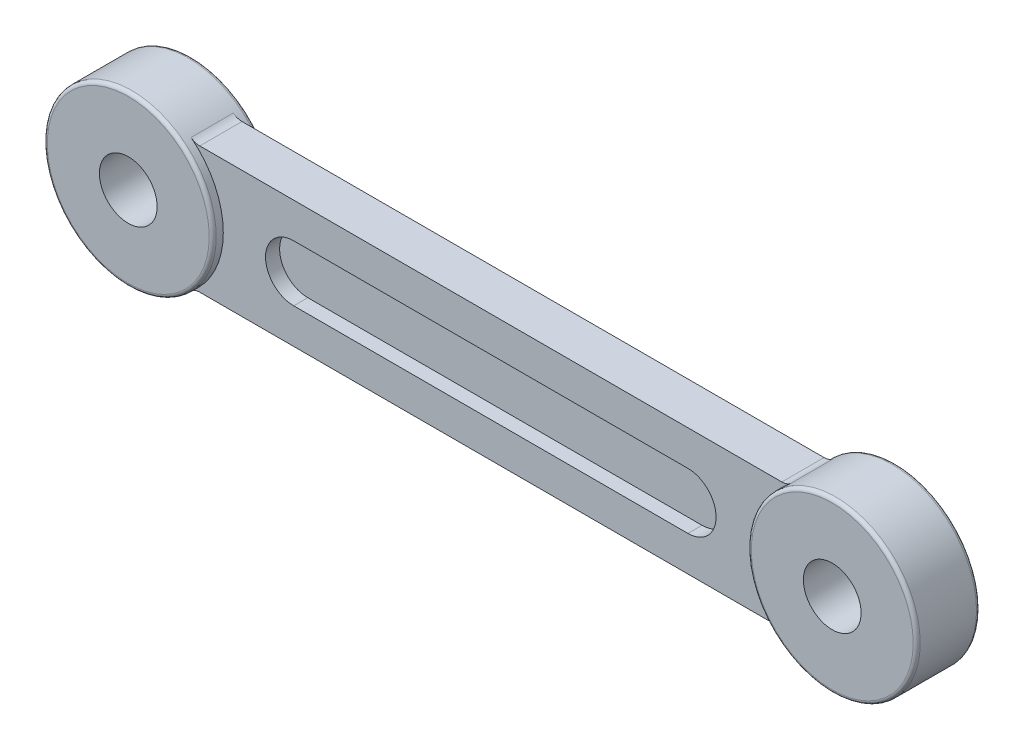
ISO-10303-21;
HEADER;
FILE_DESCRIPTION(('STEP AP214'),'2;1');
FILE_NAME('part.step','',(''),(''),'','','');
FILE_SCHEMA(('AUTOMOTIVE_DESIGN { 1 0 10303 214 1 1 1 1 }'));
ENDSEC;
DATA;
#1=APPLICATION_CONTEXT('core data for automotive mechanical design processes');
#2=APPLICATION_PROTOCOL_DEFINITION('international standard','automotive_design',2000,#1);
#3=PRODUCT_CONTEXT('',#1,'mechanical');
#4=PRODUCT('Part','Part','',(#3));
#5=PRODUCT_RELATED_PRODUCT_CATEGORY('part','',(#4));
#6=PRODUCT_DEFINITION_FORMATION('','',#4);
#7=PRODUCT_DEFINITION_CONTEXT('part definition',#1,'design');
#8=PRODUCT_DEFINITION('design','',#6,#7);
#9=PRODUCT_DEFINITION_SHAPE('','',#8);
#10=(LENGTH_UNIT() NAMED_UNIT(*) SI_UNIT(.MILLI.,.METRE.));
#11=(NAMED_UNIT(*) PLANE_ANGLE_UNIT() SI_UNIT($,.RADIAN.));
#12=(NAMED_UNIT(*) SI_UNIT($,.STERADIAN.) SOLID_ANGLE_UNIT());
#13=UNCERTAINTY_MEASURE_WITH_UNIT(LENGTH_MEASURE(1.E-05),#10,'distance_accuracy_value','');
#14=(GEOMETRIC_REPRESENTATION_CONTEXT(3) GLOBAL_UNCERTAINTY_ASSIGNED_CONTEXT((#13)) GLOBAL_UNIT_ASSIGNED_CONTEXT((#10,
#11,#12)) REPRESENTATION_CONTEXT('',''));
#15=CARTESIAN_POINT('',(0.,0.,0.));
#16=DIRECTION('',(0.,0.,1.));
#17=DIRECTION('',(1.,0.,0.));
#18=AXIS2_PLACEMENT_3D('',#15,#16,#17);
#19=CARTESIAN_POINT('',(0.,0.,-3.));
#20=DIRECTION('',(0.,0.,1.));
#21=DIRECTION('',(1.,0.,0.));
#22=AXIS2_PLACEMENT_3D('',#19,#20,#21);
#23=PLANE('',#22);
#24=CARTESIAN_POINT('',(50.,0.,-3.));
#25=DIRECTION('',(0.,0.,1.));
#26=DIRECTION('',(1.,0.,0.));
#27=AXIS2_PLACEMENT_3D('',#24,#25,#26);
#28=CIRCLE('',#27,12.);
#29=CARTESIAN_POINT('',(42.5769251104191,9.42857142857143,-3.));
#30=VERTEX_POINT('',#29);
#31=CARTESIAN_POINT('',(42.5769251104191,-9.42857142857143,-3.));
#32=VERTEX_POINT('',#31);
#33=EDGE_CURVE('E238',#30,#32,#28,.T.);
#34=ORIENTED_EDGE('',*,*,#33,.T.);
#35=CARTESIAN_POINT('',(41.3397459621556,-11.,-3.));
#36=DIRECTION('',(0.,0.,1.));
#37=DIRECTION('',(1.,0.,0.));
#38=AXIS2_PLACEMENT_3D('',#35,#36,#37);
#39=CIRCLE('',#38,2.);
#40=CARTESIAN_POINT('',(41.3397459621556,-9.,-3.));
#41=VERTEX_POINT('',#40);
#42=EDGE_CURVE('E283',#32,#41,#39,.T.);
#43=ORIENTED_EDGE('',*,*,#42,.T.);
#44=DIRECTION('',(1.,0.,0.));
#45=VECTOR('',#44,1.);
#46=CARTESIAN_POINT('',(0.,-9.,-3.));
#47=LINE('',#46,#45);
#48=CARTESIAN_POINT('',(-41.3397459621556,-9.,-3.));
#49=VERTEX_POINT('',#48);
#50=EDGE_CURVE('E245',#49,#41,#47,.T.);
#51=ORIENTED_EDGE('',*,*,#50,.F.);
#52=CARTESIAN_POINT('',(-41.3397459621556,-11.,-3.));
#53=DIRECTION('',(0.,0.,1.));
#54=DIRECTION('',(1.,0.,0.));
#55=AXIS2_PLACEMENT_3D('',#52,#53,#54);
#56=CIRCLE('',#55,2.);
#57=CARTESIAN_POINT('',(-42.5769251104191,-9.42857142857143,-3.));
#58=VERTEX_POINT('',#57);
#59=EDGE_CURVE('E287',#49,#58,#56,.T.);
#60=ORIENTED_EDGE('',*,*,#59,.T.);
#61=CARTESIAN_POINT('',(-50.,0.,-3.));
#62=DIRECTION('',(0.,0.,1.));
#63=DIRECTION('',(1.,0.,0.));
#64=AXIS2_PLACEMENT_3D('',#61,#62,#63);
#65=CIRCLE('',#64,12.);
#66=CARTESIAN_POINT('',(-42.5769251104191,9.42857142857143,-3.));
#67=VERTEX_POINT('',#66);
#68=EDGE_CURVE('E243',#58,#67,#65,.T.);
#69=ORIENTED_EDGE('',*,*,#68,.T.);
#70=CARTESIAN_POINT('',(-41.3397459621556,11.,-3.));
#71=DIRECTION('',(0.,0.,1.));
#72=DIRECTION('',(1.,0.,0.));
#73=AXIS2_PLACEMENT_3D('',#70,#71,#72);
#74=CIRCLE('',#73,2.);
#75=CARTESIAN_POINT('',(-41.3397459621556,9.,-3.));
#76=VERTEX_POINT('',#75);
#77=EDGE_CURVE('E278',#67,#76,#74,.T.);
#78=ORIENTED_EDGE('',*,*,#77,.T.);
#79=DIRECTION('',(1.,0.,0.));
#80=VECTOR('',#79,1.);
#81=CARTESIAN_POINT('',(0.,9.,-3.));
#82=LINE('',#81,#80);
#83=CARTESIAN_POINT('',(41.3397459621556,9.,-3.));
#84=VERTEX_POINT('',#83);
#85=EDGE_CURVE('E240',#76,#84,#82,.T.);
#86=ORIENTED_EDGE('',*,*,#85,.T.);
#87=CARTESIAN_POINT('',(41.3397459621556,11.,-3.));
#88=DIRECTION('',(0.,0.,1.));
#89=DIRECTION('',(1.,0.,0.));
#90=AXIS2_PLACEMENT_3D('',#87,#88,#89);
#91=CIRCLE('',#90,2.);
#92=EDGE_CURVE('E272',#84,#30,#91,.T.);
#93=ORIENTED_EDGE('',*,*,#92,.T.);
#94=EDGE_LOOP('',(#34,#43,#51,#60,#69,#78,#86,#93));
#95=FACE_BOUND('',#94,.T.);
#96=CARTESIAN_POINT('',(-28.,0.,-3.));
#97=DIRECTION('',(0.,0.,1.));
#98=DIRECTION('',(1.,0.,0.));
#99=AXIS2_PLACEMENT_3D('',#96,#97,#98);
#100=CIRCLE('',#99,4.);
#101=CARTESIAN_POINT('',(-28.,4.,-3.));
#102=VERTEX_POINT('',#101);
#103=CARTESIAN_POINT('',(-28.,-4.,-3.));
#104=VERTEX_POINT('',#103);
#105=EDGE_CURVE('E50',#102,#104,#100,.T.);
#106=ORIENTED_EDGE('',*,*,#105,.T.);
#107=DIRECTION('',(1.,0.,0.));
#108=VECTOR('',#107,1.);
#109=CARTESIAN_POINT('',(-28.,-4.,-3.));
#110=LINE('',#109,#108);
#111=CARTESIAN_POINT('',(28.,-4.,-3.));
#112=VERTEX_POINT('',#111);
#113=EDGE_CURVE('E168',#104,#112,#110,.T.);
#114=ORIENTED_EDGE('',*,*,#113,.T.);
#115=CARTESIAN_POINT('',(28.,0.,-3.));
#116=DIRECTION('',(0.,0.,1.));
#117=DIRECTION('',(1.,0.,0.));
#118=AXIS2_PLACEMENT_3D('',#115,#116,#117);
#119=CIRCLE('',#118,4.);
#120=CARTESIAN_POINT('',(28.,4.,-3.));
#121=VERTEX_POINT('',#120);
#122=EDGE_CURVE('E171',#112,#121,#119,.T.);
#123=ORIENTED_EDGE('',*,*,#122,.T.);
#124=DIRECTION('',(-1.,0.,0.));
#125=VECTOR('',#124,1.);
#126=CARTESIAN_POINT('',(-28.,4.,-3.));
#127=LINE('',#126,#125);
#128=EDGE_CURVE('E177',#121,#102,#127,.T.);
#129=ORIENTED_EDGE('',*,*,#128,.T.);
#130=EDGE_LOOP('',(#106,#114,#123,#129));
#131=FACE_BOUND('',#130,.T.);
#132=ADVANCED_FACE('F35',(#95,#131),#23,.F.);
#133=CARTESIAN_POINT('',(0.,-9.,-3.));
#134=DIRECTION('',(0.,-1.,0.));
#135=DIRECTION('',(0.,0.,-1.));
#136=AXIS2_PLACEMENT_3D('',#133,#134,#135);
#137=PLANE('',#136);
#138=ORIENTED_EDGE('',*,*,#50,.T.);
#139=DIRECTION('',(0.,0.,-1.));
#140=VECTOR('',#139,1.);
#141=CARTESIAN_POINT('',(41.3397459621556,-9.,3.));
#142=LINE('',#141,#140);
#143=CARTESIAN_POINT('',(41.3397459621556,-9.,3.));
#144=VERTEX_POINT('',#143);
#145=EDGE_CURVE('E267',#41,#144,#142,.F.);
#146=ORIENTED_EDGE('',*,*,#145,.T.);
#147=DIRECTION('',(1.,0.,0.));
#148=VECTOR('',#147,1.);
#149=CARTESIAN_POINT('',(0.,-9.,3.));
#150=LINE('',#149,#148);
#151=CARTESIAN_POINT('',(-41.3397459621556,-9.,3.));
#152=VERTEX_POINT('',#151);
#153=EDGE_CURVE('E235',#152,#144,#150,.T.);
#154=ORIENTED_EDGE('',*,*,#153,.F.);
#155=DIRECTION('',(0.,0.,-1.));
#156=VECTOR('',#155,1.);
#157=CARTESIAN_POINT('',(-41.3397459621556,-9.,-3.));
#158=LINE('',#157,#156);
#159=EDGE_CURVE('E265',#152,#49,#158,.T.);
#160=ORIENTED_EDGE('',*,*,#159,.T.);
#161=EDGE_LOOP('',(#138,#146,#154,#160));
#162=FACE_BOUND('',#161,.T.);
#163=ADVANCED_FACE('F328',(#162),#137,.T.);
#164=CARTESIAN_POINT('',(0.,9.,-3.));
#165=DIRECTION('',(0.,-1.,0.));
#166=DIRECTION('',(0.,0.,-1.));
#167=AXIS2_PLACEMENT_3D('',#164,#165,#166);
#168=PLANE('',#167);
#169=DIRECTION('',(1.,0.,0.));
#170=VECTOR('',#169,1.);
#171=CARTESIAN_POINT('',(0.,9.,3.));
#172=LINE('',#171,#170);
#173=CARTESIAN_POINT('',(-41.3397459621556,9.,3.));
#174=VERTEX_POINT('',#173);
#175=CARTESIAN_POINT('',(41.3397459621556,9.,3.));
#176=VERTEX_POINT('',#175);
#177=EDGE_CURVE('E230',#174,#176,#172,.T.);
#178=ORIENTED_EDGE('',*,*,#177,.T.);
#179=DIRECTION('',(0.,0.,1.));
#180=VECTOR('',#179,1.);
#181=CARTESIAN_POINT('',(41.3397459621556,9.,-3.));
#182=LINE('',#181,#180);
#183=EDGE_CURVE('E257',#176,#84,#182,.F.);
#184=ORIENTED_EDGE('',*,*,#183,.T.);
#185=ORIENTED_EDGE('',*,*,#85,.F.);
#186=DIRECTION('',(0.,0.,1.));
#187=VECTOR('',#186,1.);
#188=CARTESIAN_POINT('',(-41.3397459621556,9.,-3.));
#189=LINE('',#188,#187);
#190=EDGE_CURVE('E254',#76,#174,#189,.T.);
#191=ORIENTED_EDGE('',*,*,#190,.T.);
#192=EDGE_LOOP('',(#178,#184,#185,#191));
#193=FACE_BOUND('',#192,.T.);
#194=ADVANCED_FACE('F334',(#193),#168,.F.);
#195=CARTESIAN_POINT('',(0.,0.,3.));
#196=DIRECTION('',(0.,0.,1.));
#197=DIRECTION('',(1.,0.,0.));
#198=AXIS2_PLACEMENT_3D('',#195,#196,#197);
#199=PLANE('',#198);
#200=CARTESIAN_POINT('',(-28.,0.,3.));
#201=DIRECTION('',(0.,0.,1.));
#202=DIRECTION('',(1.,0.,0.));
#203=AXIS2_PLACEMENT_3D('',#200,#201,#202);
#204=CIRCLE('',#203,4.);
#205=CARTESIAN_POINT('',(-28.,4.,3.));
#206=VERTEX_POINT('',#205);
#207=CARTESIAN_POINT('',(-28.,-4.,3.));
#208=VERTEX_POINT('',#207);
#209=EDGE_CURVE('E58',#206,#208,#204,.T.);
#210=ORIENTED_EDGE('',*,*,#209,.F.);
#211=DIRECTION('',(-1.,0.,0.));
#212=VECTOR('',#211,1.);
#213=CARTESIAN_POINT('',(-28.,4.,3.));
#214=LINE('',#213,#212);
#215=CARTESIAN_POINT('',(28.,4.,3.));
#216=VERTEX_POINT('',#215);
#217=EDGE_CURVE('E190',#216,#206,#214,.T.);
#218=ORIENTED_EDGE('',*,*,#217,.F.);
#219=CARTESIAN_POINT('',(28.,0.,3.));
#220=DIRECTION('',(0.,0.,1.));
#221=DIRECTION('',(1.,0.,0.));
#222=AXIS2_PLACEMENT_3D('',#219,#220,#221);
#223=CIRCLE('',#222,4.);
#224=CARTESIAN_POINT('',(28.,-4.,3.));
#225=VERTEX_POINT('',#224);
#226=EDGE_CURVE('E204',#225,#216,#223,.T.);
#227=ORIENTED_EDGE('',*,*,#226,.F.);
#228=DIRECTION('',(1.,0.,0.));
#229=VECTOR('',#228,1.);
#230=CARTESIAN_POINT('',(-28.,-4.,3.));
#231=LINE('',#230,#229);
#232=EDGE_CURVE('E201',#208,#225,#231,.T.);
#233=ORIENTED_EDGE('',*,*,#232,.F.);
#234=EDGE_LOOP('',(#210,#218,#227,#233));
#235=FACE_BOUND('',#234,.T.);
#236=CARTESIAN_POINT('',(50.,0.,3.));
#237=DIRECTION('',(0.,0.,1.));
#238=DIRECTION('',(1.,0.,0.));
#239=AXIS2_PLACEMENT_3D('',#236,#237,#238);
#240=CIRCLE('',#239,12.);
#241=CARTESIAN_POINT('',(42.5769251104191,9.42857142857143,3.));
#242=VERTEX_POINT('',#241);
#243=CARTESIAN_POINT('',(42.5769251104191,-9.42857142857143,3.));
#244=VERTEX_POINT('',#243);
#245=EDGE_CURVE('E228',#242,#244,#240,.T.);
#246=ORIENTED_EDGE('',*,*,#245,.F.);
#247=CARTESIAN_POINT('',(41.3397459621556,11.,3.));
#248=DIRECTION('',(0.,0.,1.));
#249=DIRECTION('',(1.,0.,0.));
#250=AXIS2_PLACEMENT_3D('',#247,#248,#249);
#251=CIRCLE('',#250,2.);
#252=EDGE_CURVE('E270',#242,#176,#251,.F.);
#253=ORIENTED_EDGE('',*,*,#252,.T.);
#254=ORIENTED_EDGE('',*,*,#177,.F.);
#255=CARTESIAN_POINT('',(-41.3397459621556,11.,3.));
#256=DIRECTION('',(0.,0.,1.));
#257=DIRECTION('',(1.,0.,0.));
#258=AXIS2_PLACEMENT_3D('',#255,#256,#257);
#259=CIRCLE('',#258,2.);
#260=CARTESIAN_POINT('',(-42.5769251104191,9.42857142857143,3.));
#261=VERTEX_POINT('',#260);
#262=EDGE_CURVE('E275',#174,#261,#259,.F.);
#263=ORIENTED_EDGE('',*,*,#262,.T.);
#264=CARTESIAN_POINT('',(-50.,0.,3.));
#265=DIRECTION('',(0.,0.,1.));
#266=DIRECTION('',(1.,0.,0.));
#267=AXIS2_PLACEMENT_3D('',#264,#265,#266);
#268=CIRCLE('',#267,12.);
#269=CARTESIAN_POINT('',(-42.5769251104191,-9.42857142857143,3.));
#270=VERTEX_POINT('',#269);
#271=EDGE_CURVE('E233',#270,#261,#268,.T.);
#272=ORIENTED_EDGE('',*,*,#271,.F.);
#273=CARTESIAN_POINT('',(-41.3397459621556,-11.,3.));
#274=DIRECTION('',(0.,0.,1.));
#275=DIRECTION('',(1.,0.,0.));
#276=AXIS2_PLACEMENT_3D('',#273,#274,#275);
#277=CIRCLE('',#276,2.);
#278=EDGE_CURVE('E285',#270,#152,#277,.F.);
#279=ORIENTED_EDGE('',*,*,#278,.T.);
#280=ORIENTED_EDGE('',*,*,#153,.T.);
#281=CARTESIAN_POINT('',(41.3397459621556,-11.,3.));
#282=DIRECTION('',(0.,0.,1.));
#283=DIRECTION('',(1.,0.,0.));
#284=AXIS2_PLACEMENT_3D('',#281,#282,#283);
#285=CIRCLE('',#284,2.);
#286=EDGE_CURVE('E280',#144,#244,#285,.F.);
#287=ORIENTED_EDGE('',*,*,#286,.T.);
#288=EDGE_LOOP('',(#246,#253,#254,#263,#272,#279,#280,#287));
#289=FACE_BOUND('',#288,.T.);
#290=ADVANCED_FACE('F339',(#235,#289),#199,.T.);
#291=CARTESIAN_POINT('',(-50.,0.,-4.5));
#292=DIRECTION('',(0.,0.,1.));
#293=DIRECTION('',(1.,0.,0.));
#294=AXIS2_PLACEMENT_3D('',#291,#292,#293);
#295=CYLINDRICAL_SURFACE('',#294,12.);
#296=CARTESIAN_POINT('',(-50.,0.,-4.));
#297=DIRECTION('',(0.,0.,1.));
#298=DIRECTION('',(1.,0.,0.));
#299=AXIS2_PLACEMENT_3D('',#296,#297,#298);
#300=CIRCLE('',#299,12.);
#301=CARTESIAN_POINT('',(-38.,0.,-4.));
#302=VERTEX_POINT('',#301);
#303=EDGE_CURVE('E302',#302,#302,#300,.T.);
#304=ORIENTED_EDGE('',*,*,#303,.T.);
#305=EDGE_LOOP('',(#304));
#306=FACE_BOUND('',#305,.T.);
#307=CARTESIAN_POINT('',(-50.,0.,4.));
#308=DIRECTION('',(0.,0.,1.));
#309=DIRECTION('',(1.,0.,0.));
#310=AXIS2_PLACEMENT_3D('',#307,#308,#309);
#311=CIRCLE('',#310,12.);
#312=CARTESIAN_POINT('',(-38.,0.,4.));
#313=VERTEX_POINT('',#312);
#314=EDGE_CURVE('E299',#313,#313,#311,.F.);
#315=ORIENTED_EDGE('',*,*,#314,.T.);
#316=EDGE_LOOP('',(#315));
#317=FACE_BOUND('',#316,.T.);
#318=ORIENTED_EDGE('',*,*,#271,.T.);
#319=DIRECTION('',(0.,0.,1.));
#320=VECTOR('',#319,1.);
#321=CARTESIAN_POINT('',(-42.5769251104191,9.42857142857143,-4.5));
#322=LINE('',#321,#320);
#323=EDGE_CURVE('E262',#261,#67,#322,.F.);
#324=ORIENTED_EDGE('',*,*,#323,.T.);
#325=ORIENTED_EDGE('',*,*,#68,.F.);
#326=DIRECTION('',(0.,0.,1.));
#327=VECTOR('',#326,1.);
#328=CARTESIAN_POINT('',(-42.5769251104191,-9.42857142857143,-4.5));
#329=LINE('',#328,#327);
#330=EDGE_CURVE('E259',#58,#270,#329,.T.);
#331=ORIENTED_EDGE('',*,*,#330,.T.);
#332=EDGE_LOOP('',(#318,#324,#325,#331));
#333=FACE_BOUND('',#332,.T.);
#334=ADVANCED_FACE('F392',(#306,#317,#333),#295,.T.);
#335=CARTESIAN_POINT('',(-50.,0.,-4.5));
#336=DIRECTION('',(0.,0.,1.));
#337=DIRECTION('',(1.,0.,0.));
#338=AXIS2_PLACEMENT_3D('',#335,#336,#337);
#339=CYLINDRICAL_SURFACE('',#338,4.1);
#340=CARTESIAN_POINT('',(-50.,0.,-4.5));
#341=DIRECTION('',(0.,0.,1.));
#342=DIRECTION('',(1.,0.,0.));
#343=AXIS2_PLACEMENT_3D('',#340,#341,#342);
#344=CIRCLE('',#343,4.1);
#345=CARTESIAN_POINT('',(-45.9,0.,-4.5));
#346=VERTEX_POINT('',#345);
#347=EDGE_CURVE('E225',#346,#346,#344,.T.);
#348=ORIENTED_EDGE('',*,*,#347,.F.);
#349=EDGE_LOOP('',(#348));
#350=FACE_BOUND('',#349,.T.);
#351=CARTESIAN_POINT('',(-50.,0.,4.5));
#352=DIRECTION('',(0.,0.,1.));
#353=DIRECTION('',(1.,0.,0.));
#354=AXIS2_PLACEMENT_3D('',#351,#352,#353);
#355=CIRCLE('',#354,4.1);
#356=CARTESIAN_POINT('',(-45.9,0.,4.5));
#357=VERTEX_POINT('',#356);
#358=EDGE_CURVE('E222',#357,#357,#355,.T.);
#359=ORIENTED_EDGE('',*,*,#358,.T.);
#360=EDGE_LOOP('',(#359));
#361=FACE_BOUND('',#360,.T.);
#362=ADVANCED_FACE('F398',(#350,#361),#339,.F.);
#363=CARTESIAN_POINT('',(0.,0.,-4.5));
#364=DIRECTION('',(0.,0.,1.));
#365=DIRECTION('',(1.,0.,0.));
#366=AXIS2_PLACEMENT_3D('',#363,#364,#365);
#367=PLANE('',#366);
#368=CARTESIAN_POINT('',(-50.,0.,-4.5));
#369=DIRECTION('',(0.,0.,1.));
#370=DIRECTION('',(1.,0.,0.));
#371=AXIS2_PLACEMENT_3D('',#368,#369,#370);
#372=CIRCLE('',#371,11.5);
#373=CARTESIAN_POINT('',(-38.5,0.,-4.5));
#374=VERTEX_POINT('',#373);
#375=EDGE_CURVE('E305',#374,#374,#372,.F.);
#376=ORIENTED_EDGE('',*,*,#375,.T.);
#377=EDGE_LOOP('',(#376));
#378=FACE_BOUND('',#377,.T.);
#379=ORIENTED_EDGE('',*,*,#347,.T.);
#380=EDGE_LOOP('',(#379));
#381=FACE_BOUND('',#380,.T.);
#382=ADVANCED_FACE('F405',(#378,#381),#367,.F.);
#383=CARTESIAN_POINT('',(0.,0.,4.5));
#384=DIRECTION('',(0.,0.,1.));
#385=DIRECTION('',(1.,0.,0.));
#386=AXIS2_PLACEMENT_3D('',#383,#384,#385);
#387=PLANE('',#386);
#388=CARTESIAN_POINT('',(-50.,0.,4.5));
#389=DIRECTION('',(0.,0.,1.));
#390=DIRECTION('',(1.,0.,0.));
#391=AXIS2_PLACEMENT_3D('',#388,#389,#390);
#392=CIRCLE('',#391,11.5);
#393=CARTESIAN_POINT('',(-38.5,0.,4.5));
#394=VERTEX_POINT('',#393);
#395=EDGE_CURVE('E11',#394,#394,#392,.T.);
#396=ORIENTED_EDGE('',*,*,#395,.T.);
#397=EDGE_LOOP('',(#396));
#398=FACE_BOUND('',#397,.T.);
#399=ORIENTED_EDGE('',*,*,#358,.F.);
#400=EDGE_LOOP('',(#399));
#401=FACE_BOUND('',#400,.T.);
#402=ADVANCED_FACE('F373',(#398,#401),#387,.T.);
#403=CARTESIAN_POINT('',(50.,0.,-4.5));
#404=DIRECTION('',(0.,0.,1.));
#405=DIRECTION('',(1.,0.,0.));
#406=AXIS2_PLACEMENT_3D('',#403,#404,#405);
#407=CYLINDRICAL_SURFACE('',#406,12.);
#408=CARTESIAN_POINT('',(50.,0.,-4.));
#409=DIRECTION('',(0.,0.,1.));
#410=DIRECTION('',(1.,0.,0.));
#411=AXIS2_PLACEMENT_3D('',#408,#409,#410);
#412=CIRCLE('',#411,12.);
#413=CARTESIAN_POINT('',(62.,0.,-4.));
#414=VERTEX_POINT('',#413);
#415=EDGE_CURVE('E293',#414,#414,#412,.T.);
#416=ORIENTED_EDGE('',*,*,#415,.T.);
#417=EDGE_LOOP('',(#416));
#418=FACE_BOUND('',#417,.T.);
#419=CARTESIAN_POINT('',(50.,0.,4.));
#420=DIRECTION('',(0.,0.,1.));
#421=DIRECTION('',(1.,0.,0.));
#422=AXIS2_PLACEMENT_3D('',#419,#420,#421);
#423=CIRCLE('',#422,12.);
#424=CARTESIAN_POINT('',(62.,0.,4.));
#425=VERTEX_POINT('',#424);
#426=EDGE_CURVE('E290',#425,#425,#423,.F.);
#427=ORIENTED_EDGE('',*,*,#426,.T.);
#428=EDGE_LOOP('',(#427));
#429=FACE_BOUND('',#428,.T.);
#430=DIRECTION('',(0.,0.,1.));
#431=VECTOR('',#430,1.);
#432=CARTESIAN_POINT('',(42.5769251104191,9.42857142857143,-4.5));
#433=LINE('',#432,#431);
#434=EDGE_CURVE('E251',#30,#242,#433,.T.);
#435=ORIENTED_EDGE('',*,*,#434,.T.);
#436=ORIENTED_EDGE('',*,*,#245,.T.);
#437=DIRECTION('',(0.,0.,1.));
#438=VECTOR('',#437,1.);
#439=CARTESIAN_POINT('',(42.5769251104191,-9.42857142857143,-4.5));
#440=LINE('',#439,#438);
#441=EDGE_CURVE('E248',#244,#32,#440,.F.);
#442=ORIENTED_EDGE('',*,*,#441,.T.);
#443=ORIENTED_EDGE('',*,*,#33,.F.);
#444=EDGE_LOOP('',(#435,#436,#442,#443));
#445=FACE_BOUND('',#444,.T.);
#446=ADVANCED_FACE('F369',(#418,#429,#445),#407,.T.);
#447=CARTESIAN_POINT('',(50.,0.,-4.5));
#448=DIRECTION('',(0.,0.,1.));
#449=DIRECTION('',(1.,0.,0.));
#450=AXIS2_PLACEMENT_3D('',#447,#448,#449);
#451=CYLINDRICAL_SURFACE('',#450,4.1);
#452=CARTESIAN_POINT('',(50.,0.,-4.5));
#453=DIRECTION('',(0.,0.,1.));
#454=DIRECTION('',(1.,0.,0.));
#455=AXIS2_PLACEMENT_3D('',#452,#453,#454);
#456=CIRCLE('',#455,4.1);
#457=CARTESIAN_POINT('',(54.1,0.,-4.5));
#458=VERTEX_POINT('',#457);
#459=EDGE_CURVE('E219',#458,#458,#456,.T.);
#460=ORIENTED_EDGE('',*,*,#459,.F.);
#461=EDGE_LOOP('',(#460));
#462=FACE_BOUND('',#461,.T.);
#463=CARTESIAN_POINT('',(50.,0.,4.5));
#464=DIRECTION('',(0.,0.,1.));
#465=DIRECTION('',(1.,0.,0.));
#466=AXIS2_PLACEMENT_3D('',#463,#464,#465);
#467=CIRCLE('',#466,4.1);
#468=CARTESIAN_POINT('',(54.1,0.,4.5));
#469=VERTEX_POINT('',#468);
#470=EDGE_CURVE('E211',#469,#469,#467,.T.);
#471=ORIENTED_EDGE('',*,*,#470,.T.);
#472=EDGE_LOOP('',(#471));
#473=FACE_BOUND('',#472,.T.);
#474=ADVANCED_FACE('F372',(#462,#473),#451,.F.);
#475=CARTESIAN_POINT('',(0.,0.,-4.5));
#476=DIRECTION('',(0.,0.,1.));
#477=DIRECTION('',(1.,0.,0.));
#478=AXIS2_PLACEMENT_3D('',#475,#476,#477);
#479=PLANE('',#478);
#480=CARTESIAN_POINT('',(50.,0.,-4.5));
#481=DIRECTION('',(0.,0.,1.));
#482=DIRECTION('',(1.,0.,0.));
#483=AXIS2_PLACEMENT_3D('',#480,#481,#482);
#484=CIRCLE('',#483,11.5);
#485=CARTESIAN_POINT('',(61.5,0.,-4.5));
#486=VERTEX_POINT('',#485);
#487=EDGE_CURVE('E296',#486,#486,#484,.F.);
#488=ORIENTED_EDGE('',*,*,#487,.T.);
#489=EDGE_LOOP('',(#488));
#490=FACE_BOUND('',#489,.T.);
#491=ORIENTED_EDGE('',*,*,#459,.T.);
#492=EDGE_LOOP('',(#491));
#493=FACE_BOUND('',#492,.T.);
#494=ADVANCED_FACE('F417',(#490,#493),#479,.F.);
#495=CARTESIAN_POINT('',(0.,0.,4.5));
#496=DIRECTION('',(0.,0.,1.));
#497=DIRECTION('',(1.,0.,0.));
#498=AXIS2_PLACEMENT_3D('',#495,#496,#497);
#499=PLANE('',#498);
#500=CARTESIAN_POINT('',(50.,0.,4.5));
#501=DIRECTION('',(0.,0.,1.));
#502=DIRECTION('',(1.,0.,0.));
#503=AXIS2_PLACEMENT_3D('',#500,#501,#502);
#504=CIRCLE('',#503,11.5);
#505=CARTESIAN_POINT('',(61.5,0.,4.5));
#506=VERTEX_POINT('',#505);
#507=EDGE_CURVE('E43',#506,#506,#504,.T.);
#508=ORIENTED_EDGE('',*,*,#507,.T.);
#509=EDGE_LOOP('',(#508));
#510=FACE_BOUND('',#509,.T.);
#511=ORIENTED_EDGE('',*,*,#470,.F.);
#512=EDGE_LOOP('',(#511));
#513=FACE_BOUND('',#512,.T.);
#514=ADVANCED_FACE('F310',(#510,#513),#499,.T.);
#515=CARTESIAN_POINT('',(41.3397459621556,11.,-4.5));
#516=DIRECTION('',(0.,0.,1.));
#517=DIRECTION('',(1.,0.,0.));
#518=AXIS2_PLACEMENT_3D('',#515,#516,#517);
#519=CYLINDRICAL_SURFACE('',#518,2.);
#520=ORIENTED_EDGE('',*,*,#92,.F.);
#521=ORIENTED_EDGE('',*,*,#183,.F.);
#522=ORIENTED_EDGE('',*,*,#252,.F.);
#523=ORIENTED_EDGE('',*,*,#434,.F.);
#524=EDGE_LOOP('',(#520,#521,#522,#523));
#525=FACE_BOUND('',#524,.T.);
#526=ADVANCED_FACE('F345',(#525),#519,.F.);
#527=CARTESIAN_POINT('',(-41.3397459621556,11.,-4.5));
#528=DIRECTION('',(0.,0.,1.));
#529=DIRECTION('',(1.,0.,0.));
#530=AXIS2_PLACEMENT_3D('',#527,#528,#529);
#531=CYLINDRICAL_SURFACE('',#530,2.);
#532=ORIENTED_EDGE('',*,*,#77,.F.);
#533=ORIENTED_EDGE('',*,*,#323,.F.);
#534=ORIENTED_EDGE('',*,*,#262,.F.);
#535=ORIENTED_EDGE('',*,*,#190,.F.);
#536=EDGE_LOOP('',(#532,#533,#534,#535));
#537=FACE_BOUND('',#536,.T.);
#538=ADVANCED_FACE('F348',(#537),#531,.F.);
#539=CARTESIAN_POINT('',(41.3397459621556,-11.,-4.5));
#540=DIRECTION('',(0.,0.,1.));
#541=DIRECTION('',(1.,0.,0.));
#542=AXIS2_PLACEMENT_3D('',#539,#540,#541);
#543=CYLINDRICAL_SURFACE('',#542,2.);
#544=ORIENTED_EDGE('',*,*,#42,.F.);
#545=ORIENTED_EDGE('',*,*,#441,.F.);
#546=ORIENTED_EDGE('',*,*,#286,.F.);
#547=ORIENTED_EDGE('',*,*,#145,.F.);
#548=EDGE_LOOP('',(#544,#545,#546,#547));
#549=FACE_BOUND('',#548,.T.);
#550=ADVANCED_FACE('F352',(#549),#543,.F.);
#551=CARTESIAN_POINT('',(-41.3397459621556,-11.,-4.5));
#552=DIRECTION('',(0.,0.,1.));
#553=DIRECTION('',(1.,0.,0.));
#554=AXIS2_PLACEMENT_3D('',#551,#552,#553);
#555=CYLINDRICAL_SURFACE('',#554,2.);
#556=ORIENTED_EDGE('',*,*,#59,.F.);
#557=ORIENTED_EDGE('',*,*,#159,.F.);
#558=ORIENTED_EDGE('',*,*,#278,.F.);
#559=ORIENTED_EDGE('',*,*,#330,.F.);
#560=EDGE_LOOP('',(#556,#557,#558,#559));
#561=FACE_BOUND('',#560,.T.);
#562=ADVANCED_FACE('F356',(#561),#555,.F.);
#563=CARTESIAN_POINT('',(50.,0.,-4.));
#564=DIRECTION('',(0.,0.,1.));
#565=DIRECTION('',(1.,0.,0.));
#566=AXIS2_PLACEMENT_3D('',#563,#564,#565);
#567=TOROIDAL_SURFACE('',#566,11.5,0.5);
#568=ORIENTED_EDGE('',*,*,#487,.F.);
#569=EDGE_LOOP('',(#568));
#570=FACE_BOUND('',#569,.T.);
#571=ORIENTED_EDGE('',*,*,#415,.F.);
#572=EDGE_LOOP('',(#571));
#573=FACE_BOUND('',#572,.T.);
#574=ADVANCED_FACE('F323',(#570,#573),#567,.T.);
#575=CARTESIAN_POINT('',(-50.,0.,-4.));
#576=DIRECTION('',(0.,0.,1.));
#577=DIRECTION('',(1.,0.,0.));
#578=AXIS2_PLACEMENT_3D('',#575,#576,#577);
#579=TOROIDAL_SURFACE('',#578,11.5,0.5);
#580=ORIENTED_EDGE('',*,*,#375,.F.);
#581=EDGE_LOOP('',(#580));
#582=FACE_BOUND('',#581,.T.);
#583=ORIENTED_EDGE('',*,*,#303,.F.);
#584=EDGE_LOOP('',(#583));
#585=FACE_BOUND('',#584,.T.);
#586=ADVANCED_FACE('F315',(#582,#585),#579,.T.);
#587=CARTESIAN_POINT('',(50.,0.,4.));
#588=DIRECTION('',(0.,0.,1.));
#589=DIRECTION('',(1.,0.,0.));
#590=AXIS2_PLACEMENT_3D('',#587,#588,#589);
#591=TOROIDAL_SURFACE('',#590,11.5,0.5);
#592=ORIENTED_EDGE('',*,*,#426,.F.);
#593=EDGE_LOOP('',(#592));
#594=FACE_BOUND('',#593,.T.);
#595=ORIENTED_EDGE('',*,*,#507,.F.);
#596=EDGE_LOOP('',(#595));
#597=FACE_BOUND('',#596,.T.);
#598=ADVANCED_FACE('F313',(#594,#597),#591,.T.);
#599=CARTESIAN_POINT('',(-50.,0.,4.));
#600=DIRECTION('',(0.,0.,1.));
#601=DIRECTION('',(1.,0.,0.));
#602=AXIS2_PLACEMENT_3D('',#599,#600,#601);
#603=TOROIDAL_SURFACE('',#602,11.5,0.5);
#604=ORIENTED_EDGE('',*,*,#314,.F.);
#605=EDGE_LOOP('',(#604));
#606=FACE_BOUND('',#605,.T.);
#607=ORIENTED_EDGE('',*,*,#395,.F.);
#608=EDGE_LOOP('',(#607));
#609=FACE_BOUND('',#608,.T.);
#610=ADVANCED_FACE('F37',(#606,#609),#603,.T.);
#611=CARTESIAN_POINT('',(-28.,0.,1.));
#612=DIRECTION('',(0.,0.,1.));
#613=DIRECTION('',(1.,0.,0.));
#614=AXIS2_PLACEMENT_3D('',#611,#612,#613);
#615=CYLINDRICAL_SURFACE('',#614,4.);
#616=ORIENTED_EDGE('',*,*,#209,.T.);
#617=DIRECTION('',(0.,0.,1.));
#618=VECTOR('',#617,1.);
#619=CARTESIAN_POINT('',(-28.,-4.,1.));
#620=LINE('',#619,#618);
#621=CARTESIAN_POINT('',(-28.,-4.,1.));
#622=VERTEX_POINT('',#621);
#623=EDGE_CURVE('E199',#622,#208,#620,.T.);
#624=ORIENTED_EDGE('',*,*,#623,.F.);
#625=CARTESIAN_POINT('',(-28.,0.,1.));
#626=DIRECTION('',(0.,0.,1.));
#627=DIRECTION('',(1.,0.,0.));
#628=AXIS2_PLACEMENT_3D('',#625,#626,#627);
#629=CIRCLE('',#628,4.);
#630=CARTESIAN_POINT('',(-28.,4.,1.));
#631=VERTEX_POINT('',#630);
#632=EDGE_CURVE('E186',#631,#622,#629,.T.);
#633=ORIENTED_EDGE('',*,*,#632,.F.);
#634=DIRECTION('',(0.,0.,1.));
#635=VECTOR('',#634,1.);
#636=CARTESIAN_POINT('',(-28.,4.,1.));
#637=LINE('',#636,#635);
#638=EDGE_CURVE('E209',#631,#206,#637,.T.);
#639=ORIENTED_EDGE('',*,*,#638,.T.);
#640=EDGE_LOOP('',(#616,#624,#633,#639));
#641=FACE_BOUND('',#640,.T.);
#642=ADVANCED_FACE('F321',(#641),#615,.F.);
#643=CARTESIAN_POINT('',(-28.,4.,1.));
#644=DIRECTION('',(0.,1.,0.));
#645=DIRECTION('',(0.,0.,1.));
#646=AXIS2_PLACEMENT_3D('',#643,#644,#645);
#647=PLANE('',#646);
#648=ORIENTED_EDGE('',*,*,#217,.T.);
#649=ORIENTED_EDGE('',*,*,#638,.F.);
#650=DIRECTION('',(-1.,0.,0.));
#651=VECTOR('',#650,1.);
#652=CARTESIAN_POINT('',(-28.,4.,1.));
#653=LINE('',#652,#651);
#654=CARTESIAN_POINT('',(28.,4.,1.));
#655=VERTEX_POINT('',#654);
#656=EDGE_CURVE('E196',#655,#631,#653,.T.);
#657=ORIENTED_EDGE('',*,*,#656,.F.);
#658=DIRECTION('',(0.,0.,1.));
#659=VECTOR('',#658,1.);
#660=CARTESIAN_POINT('',(28.,4.,1.));
#661=LINE('',#660,#659);
#662=EDGE_CURVE('E212',#655,#216,#661,.T.);
#663=ORIENTED_EDGE('',*,*,#662,.T.);
#664=EDGE_LOOP('',(#648,#649,#657,#663));
#665=FACE_BOUND('',#664,.T.);
#666=ADVANCED_FACE('F427',(#665),#647,.F.);
#667=CARTESIAN_POINT('',(28.,0.,1.));
#668=DIRECTION('',(0.,0.,1.));
#669=DIRECTION('',(1.,0.,0.));
#670=AXIS2_PLACEMENT_3D('',#667,#668,#669);
#671=CYLINDRICAL_SURFACE('',#670,4.);
#672=ORIENTED_EDGE('',*,*,#226,.T.);
#673=ORIENTED_EDGE('',*,*,#662,.F.);
#674=CARTESIAN_POINT('',(28.,0.,1.));
#675=DIRECTION('',(0.,0.,1.));
#676=DIRECTION('',(1.,0.,0.));
#677=AXIS2_PLACEMENT_3D('',#674,#675,#676);
#678=CIRCLE('',#677,4.);
#679=CARTESIAN_POINT('',(28.,-4.,1.));
#680=VERTEX_POINT('',#679);
#681=EDGE_CURVE('E193',#680,#655,#678,.T.);
#682=ORIENTED_EDGE('',*,*,#681,.F.);
#683=DIRECTION('',(0.,0.,1.));
#684=VECTOR('',#683,1.);
#685=CARTESIAN_POINT('',(28.,-4.,1.));
#686=LINE('',#685,#684);
#687=EDGE_CURVE('E214',#680,#225,#686,.T.);
#688=ORIENTED_EDGE('',*,*,#687,.T.);
#689=EDGE_LOOP('',(#672,#673,#682,#688));
#690=FACE_BOUND('',#689,.T.);
#691=ADVANCED_FACE('F432',(#690),#671,.F.);
#692=CARTESIAN_POINT('',(-28.,-4.,1.));
#693=DIRECTION('',(0.,-1.,0.));
#694=DIRECTION('',(0.,0.,-1.));
#695=AXIS2_PLACEMENT_3D('',#692,#693,#694);
#696=PLANE('',#695);
#697=ORIENTED_EDGE('',*,*,#232,.T.);
#698=ORIENTED_EDGE('',*,*,#687,.F.);
#699=DIRECTION('',(1.,0.,0.));
#700=VECTOR('',#699,1.);
#701=CARTESIAN_POINT('',(-28.,-4.,1.));
#702=LINE('',#701,#700);
#703=EDGE_CURVE('E189',#622,#680,#702,.T.);
#704=ORIENTED_EDGE('',*,*,#703,.F.);
#705=ORIENTED_EDGE('',*,*,#623,.T.);
#706=EDGE_LOOP('',(#697,#698,#704,#705));
#707=FACE_BOUND('',#706,.T.);
#708=ADVANCED_FACE('F428',(#707),#696,.F.);
#709=CARTESIAN_POINT('',(-28.,0.,1.));
#710=DIRECTION('',(0.,0.,1.));
#711=DIRECTION('',(1.,0.,0.));
#712=AXIS2_PLACEMENT_3D('',#709,#710,#711);
#713=PLANE('',#712);
#714=ORIENTED_EDGE('',*,*,#632,.T.);
#715=ORIENTED_EDGE('',*,*,#703,.T.);
#716=ORIENTED_EDGE('',*,*,#681,.T.);
#717=ORIENTED_EDGE('',*,*,#656,.T.);
#718=EDGE_LOOP('',(#714,#715,#716,#717));
#719=FACE_BOUND('',#718,.T.);
#720=ADVANCED_FACE('F431',(#719),#713,.T.);
#721=CARTESIAN_POINT('',(-28.,0.,-1.));
#722=DIRECTION('',(0.,0.,-1.));
#723=DIRECTION('',(-1.,0.,0.));
#724=AXIS2_PLACEMENT_3D('',#721,#722,#723);
#725=CYLINDRICAL_SURFACE('',#724,4.);
#726=ORIENTED_EDGE('',*,*,#105,.F.);
#727=DIRECTION('',(0.,0.,-1.));
#728=VECTOR('',#727,1.);
#729=CARTESIAN_POINT('',(-28.,4.,-1.));
#730=LINE('',#729,#728);
#731=CARTESIAN_POINT('',(-28.,4.,-1.));
#732=VERTEX_POINT('',#731);
#733=EDGE_CURVE('E153',#732,#102,#730,.T.);
#734=ORIENTED_EDGE('',*,*,#733,.F.);
#735=CARTESIAN_POINT('',(-28.,0.,-1.));
#736=DIRECTION('',(0.,0.,1.));
#737=DIRECTION('',(1.,0.,0.));
#738=AXIS2_PLACEMENT_3D('',#735,#736,#737);
#739=CIRCLE('',#738,4.);
#740=CARTESIAN_POINT('',(-28.,-4.,-1.));
#741=VERTEX_POINT('',#740);
#742=EDGE_CURVE('E160',#732,#741,#739,.T.);
#743=ORIENTED_EDGE('',*,*,#742,.T.);
#744=DIRECTION('',(0.,0.,-1.));
#745=VECTOR('',#744,1.);
#746=CARTESIAN_POINT('',(-28.,-4.,-1.));
#747=LINE('',#746,#745);
#748=EDGE_CURVE('E181',#741,#104,#747,.T.);
#749=ORIENTED_EDGE('',*,*,#748,.T.);
#750=EDGE_LOOP('',(#726,#734,#743,#749));
#751=FACE_BOUND('',#750,.T.);
#752=ADVANCED_FACE('F163',(#751),#725,.F.);
#753=CARTESIAN_POINT('',(-28.,-4.,-1.));
#754=DIRECTION('',(0.,1.,0.));
#755=DIRECTION('',(0.,0.,1.));
#756=AXIS2_PLACEMENT_3D('',#753,#754,#755);
#757=PLANE('',#756);
#758=ORIENTED_EDGE('',*,*,#113,.F.);
#759=ORIENTED_EDGE('',*,*,#748,.F.);
#760=DIRECTION('',(1.,0.,0.));
#761=VECTOR('',#760,1.);
#762=CARTESIAN_POINT('',(-28.,-4.,-1.));
#763=LINE('',#762,#761);
#764=CARTESIAN_POINT('',(28.,-4.,-1.));
#765=VERTEX_POINT('',#764);
#766=EDGE_CURVE('E165',#741,#765,#763,.T.);
#767=ORIENTED_EDGE('',*,*,#766,.T.);
#768=DIRECTION('',(0.,0.,-1.));
#769=VECTOR('',#768,1.);
#770=CARTESIAN_POINT('',(28.,-4.,-1.));
#771=LINE('',#770,#769);
#772=EDGE_CURVE('E183',#765,#112,#771,.T.);
#773=ORIENTED_EDGE('',*,*,#772,.T.);
#774=EDGE_LOOP('',(#758,#759,#767,#773));
#775=FACE_BOUND('',#774,.T.);
#776=ADVANCED_FACE('F445',(#775),#757,.T.);
#777=CARTESIAN_POINT('',(28.,0.,-1.));
#778=DIRECTION('',(0.,0.,-1.));
#779=DIRECTION('',(-1.,0.,0.));
#780=AXIS2_PLACEMENT_3D('',#777,#778,#779);
#781=CYLINDRICAL_SURFACE('',#780,4.);
#782=ORIENTED_EDGE('',*,*,#122,.F.);
#783=ORIENTED_EDGE('',*,*,#772,.F.);
#784=CARTESIAN_POINT('',(28.,0.,-1.));
#785=DIRECTION('',(0.,0.,1.));
#786=DIRECTION('',(1.,0.,0.));
#787=AXIS2_PLACEMENT_3D('',#784,#785,#786);
#788=CIRCLE('',#787,4.);
#789=CARTESIAN_POINT('',(28.,4.,-1.));
#790=VERTEX_POINT('',#789);
#791=EDGE_CURVE('E159',#765,#790,#788,.T.);
#792=ORIENTED_EDGE('',*,*,#791,.T.);
#793=DIRECTION('',(0.,0.,-1.));
#794=VECTOR('',#793,1.);
#795=CARTESIAN_POINT('',(28.,4.,-1.));
#796=LINE('',#795,#794);
#797=EDGE_CURVE('E155',#790,#121,#796,.T.);
#798=ORIENTED_EDGE('',*,*,#797,.T.);
#799=EDGE_LOOP('',(#782,#783,#792,#798));
#800=FACE_BOUND('',#799,.T.);
#801=ADVANCED_FACE('F448',(#800),#781,.F.);
#802=CARTESIAN_POINT('',(-28.,4.,-1.));
#803=DIRECTION('',(0.,-1.,0.));
#804=DIRECTION('',(0.,0.,-1.));
#805=AXIS2_PLACEMENT_3D('',#802,#803,#804);
#806=PLANE('',#805);
#807=ORIENTED_EDGE('',*,*,#128,.F.);
#808=ORIENTED_EDGE('',*,*,#797,.F.);
#809=DIRECTION('',(-1.,0.,0.));
#810=VECTOR('',#809,1.);
#811=CARTESIAN_POINT('',(-28.,4.,-1.));
#812=LINE('',#811,#810);
#813=EDGE_CURVE('E150',#790,#732,#812,.T.);
#814=ORIENTED_EDGE('',*,*,#813,.T.);
#815=ORIENTED_EDGE('',*,*,#733,.T.);
#816=EDGE_LOOP('',(#807,#808,#814,#815));
#817=FACE_BOUND('',#816,.T.);
#818=ADVANCED_FACE('F152',(#817),#806,.T.);
#819=CARTESIAN_POINT('',(-28.,0.,-1.));
#820=DIRECTION('',(0.,0.,-1.));
#821=DIRECTION('',(1.,0.,0.));
#822=AXIS2_PLACEMENT_3D('',#819,#820,#821);
#823=PLANE('',#822);
#824=ORIENTED_EDGE('',*,*,#742,.F.);
#825=ORIENTED_EDGE('',*,*,#813,.F.);
#826=ORIENTED_EDGE('',*,*,#791,.F.);
#827=ORIENTED_EDGE('',*,*,#766,.F.);
#828=EDGE_LOOP('',(#824,#825,#826,#827));
#829=FACE_BOUND('',#828,.T.);
#830=ADVANCED_FACE('F167',(#829),#823,.T.);
#831=CLOSED_SHELL('',(#132,#163,#194,#290,#334,#362,#382,#402,#446,#474,#494,#514,#526,#538,
#550,#562,#574,#586,#598,#610,#642,#666,#691,#708,#720,#752,#776,#801,#818,#830));
#832=MANIFOLD_SOLID_BREP('B2',#831);
#833=ADVANCED_BREP_SHAPE_REPRESENTATION('',(#18,#832),#14);
#834=SHAPE_DEFINITION_REPRESENTATION(#9,#833);
ENDSEC;
END-ISO-10303-21;
